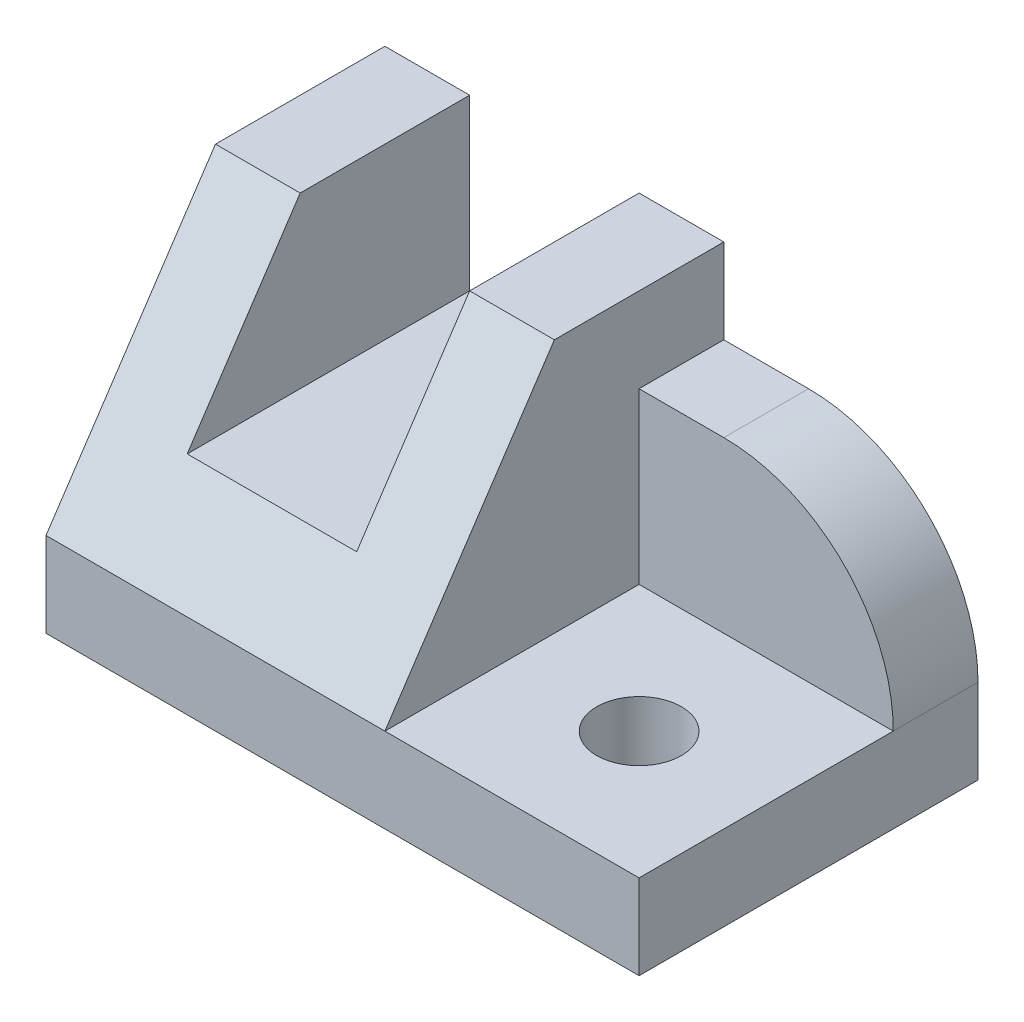
ISO-10303-21;
HEADER;
FILE_DESCRIPTION(('STEP AP214'),'2;1');
FILE_NAME('part.step','',(''),(''),'','','');
FILE_SCHEMA(('AUTOMOTIVE_DESIGN { 1 0 10303 214 1 1 1 1 }'));
ENDSEC;
DATA;
#1=APPLICATION_CONTEXT('core data for automotive mechanical design processes');
#2=APPLICATION_PROTOCOL_DEFINITION('international standard','automotive_design',2000,#1);
#3=PRODUCT_CONTEXT('',#1,'mechanical');
#4=PRODUCT('Part','Part','',(#3));
#5=PRODUCT_RELATED_PRODUCT_CATEGORY('part','',(#4));
#6=PRODUCT_DEFINITION_FORMATION('','',#4);
#7=PRODUCT_DEFINITION_CONTEXT('part definition',#1,'design');
#8=PRODUCT_DEFINITION('design','',#6,#7);
#9=PRODUCT_DEFINITION_SHAPE('','',#8);
#10=(LENGTH_UNIT() NAMED_UNIT(*) SI_UNIT(.MILLI.,.METRE.));
#11=(NAMED_UNIT(*) PLANE_ANGLE_UNIT() SI_UNIT($,.RADIAN.));
#12=(NAMED_UNIT(*) SI_UNIT($,.STERADIAN.) SOLID_ANGLE_UNIT());
#13=UNCERTAINTY_MEASURE_WITH_UNIT(LENGTH_MEASURE(1.E-05),#10,'distance_accuracy_value','');
#14=(GEOMETRIC_REPRESENTATION_CONTEXT(3) GLOBAL_UNCERTAINTY_ASSIGNED_CONTEXT((#13)) GLOBAL_UNIT_ASSIGNED_CONTEXT((#10,
#11,#12)) REPRESENTATION_CONTEXT('',''));
#15=CARTESIAN_POINT('',(0.,0.,0.));
#16=DIRECTION('',(0.,0.,1.));
#17=DIRECTION('',(1.,0.,0.));
#18=AXIS2_PLACEMENT_3D('',#15,#16,#17);
#19=CARTESIAN_POINT('',(5.,40.,0.));
#20=DIRECTION('',(0.,1.,0.));
#21=DIRECTION('',(0.,0.,1.));
#22=AXIS2_PLACEMENT_3D('',#19,#20,#21);
#23=PLANE('',#22);
#24=DIRECTION('',(0.,0.,-1.));
#25=VECTOR('',#24,1.);
#26=CARTESIAN_POINT('',(-25.,40.,20.001));
#27=LINE('',#26,#25);
#28=CARTESIAN_POINT('',(-25.,40.,0.));
#29=VERTEX_POINT('',#28);
#30=CARTESIAN_POINT('',(-25.,40.,-20.));
#31=VERTEX_POINT('',#30);
#32=EDGE_CURVE('E177',#29,#31,#27,.T.);
#33=ORIENTED_EDGE('',*,*,#32,.T.);
#34=DIRECTION('',(-1.,0.,0.));
#35=VECTOR('',#34,1.);
#36=CARTESIAN_POINT('',(5.,40.,-20.));
#37=LINE('',#36,#35);
#38=CARTESIAN_POINT('',(-35.,40.,-20.));
#39=VERTEX_POINT('',#38);
#40=EDGE_CURVE('E196',#31,#39,#37,.T.);
#41=ORIENTED_EDGE('',*,*,#40,.T.);
#42=DIRECTION('',(0.,0.,-1.));
#43=VECTOR('',#42,1.);
#44=CARTESIAN_POINT('',(-35.,40.,0.));
#45=LINE('',#44,#43);
#46=CARTESIAN_POINT('',(-35.,40.,0.));
#47=VERTEX_POINT('',#46);
#48=EDGE_CURVE('E180',#47,#39,#45,.T.);
#49=ORIENTED_EDGE('',*,*,#48,.F.);
#50=DIRECTION('',(-1.,0.,0.));
#51=VECTOR('',#50,1.);
#52=CARTESIAN_POINT('',(5.,40.,0.));
#53=LINE('',#52,#51);
#54=EDGE_CURVE('E205',#29,#47,#53,.T.);
#55=ORIENTED_EDGE('',*,*,#54,.F.);
#56=EDGE_LOOP('',(#33,#41,#49,#55));
#57=FACE_BOUND('',#56,.T.);
#58=ADVANCED_FACE('F33',(#57),#23,.T.);
#59=CARTESIAN_POINT('',(-35.,10.,-20.));
#60=DIRECTION('',(0.,0.,-1.));
#61=DIRECTION('',(-1.,0.,0.));
#62=AXIS2_PLACEMENT_3D('',#59,#60,#61);
#63=PLANE('',#62);
#64=CARTESIAN_POINT('',(15.,10.0000000000001,-20.));
#65=DIRECTION('',(0.,0.,-1.));
#66=DIRECTION('',(1.,0.,0.));
#67=AXIS2_PLACEMENT_3D('',#64,#65,#66);
#68=CIRCLE('',#67,20.);
#69=CARTESIAN_POINT('',(15.,30.0000000000001,-20.));
#70=VERTEX_POINT('',#69);
#71=CARTESIAN_POINT('',(35.,10.,-20.));
#72=VERTEX_POINT('',#71);
#73=EDGE_CURVE('E152',#70,#72,#68,.T.);
#74=ORIENTED_EDGE('',*,*,#73,.T.);
#75=DIRECTION('',(0.,-1.,0.));
#76=VECTOR('',#75,1.);
#77=CARTESIAN_POINT('',(35.,10.,-20.));
#78=LINE('',#77,#76);
#79=CARTESIAN_POINT('',(35.,0.,-20.));
#80=VERTEX_POINT('',#79);
#81=EDGE_CURVE('E37',#72,#80,#78,.T.);
#82=ORIENTED_EDGE('',*,*,#81,.T.);
#83=DIRECTION('',(1.,0.,0.));
#84=VECTOR('',#83,1.);
#85=CARTESIAN_POINT('',(-35.,0.,-20.));
#86=LINE('',#85,#84);
#87=CARTESIAN_POINT('',(-35.,0.,-20.));
#88=VERTEX_POINT('',#87);
#89=EDGE_CURVE('E212',#88,#80,#86,.T.);
#90=ORIENTED_EDGE('',*,*,#89,.F.);
#91=DIRECTION('',(0.,-1.,0.));
#92=VECTOR('',#91,1.);
#93=CARTESIAN_POINT('',(-35.,10.,-20.));
#94=LINE('',#93,#92);
#95=EDGE_CURVE('E11',#39,#88,#94,.T.);
#96=ORIENTED_EDGE('',*,*,#95,.F.);
#97=ORIENTED_EDGE('',*,*,#40,.F.);
#98=DIRECTION('',(0.,1.,0.));
#99=VECTOR('',#98,1.);
#100=CARTESIAN_POINT('',(-25.,40.,-20.));
#101=LINE('',#100,#99);
#102=CARTESIAN_POINT('',(-25.,20.,-20.));
#103=VERTEX_POINT('',#102);
#104=EDGE_CURVE('E170',#103,#31,#101,.T.);
#105=ORIENTED_EDGE('',*,*,#104,.F.);
#106=DIRECTION('',(-1.,0.,0.));
#107=VECTOR('',#106,1.);
#108=CARTESIAN_POINT('',(-5.00000000000001,20.,-20.));
#109=LINE('',#108,#107);
#110=CARTESIAN_POINT('',(-5.00000000000001,20.,-20.));
#111=VERTEX_POINT('',#110);
#112=EDGE_CURVE('E174',#111,#103,#109,.T.);
#113=ORIENTED_EDGE('',*,*,#112,.F.);
#114=DIRECTION('',(0.,-1.,0.));
#115=VECTOR('',#114,1.);
#116=CARTESIAN_POINT('',(-5.00000000000001,40.,-20.));
#117=LINE('',#116,#115);
#118=CARTESIAN_POINT('',(-5.00000000000001,40.,-20.));
#119=VERTEX_POINT('',#118);
#120=EDGE_CURVE('E172',#119,#111,#117,.T.);
#121=ORIENTED_EDGE('',*,*,#120,.F.);
#122=CARTESIAN_POINT('',(5.,40.,-20.));
#123=VERTEX_POINT('',#122);
#124=EDGE_CURVE('E206',#123,#119,#37,.T.);
#125=ORIENTED_EDGE('',*,*,#124,.F.);
#126=DIRECTION('',(0.,-1.,0.));
#127=VECTOR('',#126,1.);
#128=CARTESIAN_POINT('',(5.,40.,-20.));
#129=LINE('',#128,#127);
#130=CARTESIAN_POINT('',(5.,30.0000000000001,-20.));
#131=VERTEX_POINT('',#130);
#132=EDGE_CURVE('E189',#123,#131,#129,.T.);
#133=ORIENTED_EDGE('',*,*,#132,.T.);
#134=DIRECTION('',(1.,0.,0.));
#135=VECTOR('',#134,1.);
#136=CARTESIAN_POINT('',(5.,30.0000000000001,-20.));
#137=LINE('',#136,#135);
#138=EDGE_CURVE('E136',#131,#70,#137,.T.);
#139=ORIENTED_EDGE('',*,*,#138,.T.);
#140=EDGE_LOOP('',(#74,#82,#90,#96,#97,#105,#113,#121,#125,#133,#139));
#141=FACE_BOUND('',#140,.T.);
#142=ADVANCED_FACE('F35',(#141),#63,.T.);
#143=CARTESIAN_POINT('',(-35.,10.,-20.));
#144=DIRECTION('',(1.,0.,0.));
#145=DIRECTION('',(0.,0.,-1.));
#146=AXIS2_PLACEMENT_3D('',#143,#144,#145);
#147=PLANE('',#146);
#148=DIRECTION('',(0.,0.,1.));
#149=VECTOR('',#148,1.);
#150=CARTESIAN_POINT('',(-35.,0.,-20.));
#151=LINE('',#150,#149);
#152=CARTESIAN_POINT('',(-35.,0.,20.));
#153=VERTEX_POINT('',#152);
#154=EDGE_CURVE('E231',#88,#153,#151,.T.);
#155=ORIENTED_EDGE('',*,*,#154,.T.);
#156=DIRECTION('',(0.,-1.,0.));
#157=VECTOR('',#156,1.);
#158=CARTESIAN_POINT('',(-35.,10.,20.));
#159=LINE('',#158,#157);
#160=CARTESIAN_POINT('',(-35.,10.,20.));
#161=VERTEX_POINT('',#160);
#162=EDGE_CURVE('E42',#161,#153,#159,.T.);
#163=ORIENTED_EDGE('',*,*,#162,.F.);
#164=DIRECTION('',(0.,0.832050294337844,-0.554700196225229));
#165=VECTOR('',#164,1.);
#166=CARTESIAN_POINT('',(-35.,10.,20.));
#167=LINE('',#166,#165);
#168=EDGE_CURVE('E190',#161,#47,#167,.T.);
#169=ORIENTED_EDGE('',*,*,#168,.T.);
#170=ORIENTED_EDGE('',*,*,#48,.T.);
#171=ORIENTED_EDGE('',*,*,#95,.T.);
#172=EDGE_LOOP('',(#155,#163,#169,#170,#171));
#173=FACE_BOUND('',#172,.T.);
#174=ADVANCED_FACE('F250',(#173),#147,.F.);
#175=CARTESIAN_POINT('',(-35.,10.,20.));
#176=DIRECTION('',(0.,0.,-1.));
#177=DIRECTION('',(-1.,0.,0.));
#178=AXIS2_PLACEMENT_3D('',#175,#176,#177);
#179=PLANE('',#178);
#180=DIRECTION('',(1.,0.,0.));
#181=VECTOR('',#180,1.);
#182=CARTESIAN_POINT('',(-35.,0.,20.));
#183=LINE('',#182,#181);
#184=CARTESIAN_POINT('',(35.,0.,20.));
#185=VERTEX_POINT('',#184);
#186=EDGE_CURVE('E228',#153,#185,#183,.T.);
#187=ORIENTED_EDGE('',*,*,#186,.T.);
#188=DIRECTION('',(0.,-1.,0.));
#189=VECTOR('',#188,1.);
#190=CARTESIAN_POINT('',(35.,10.,20.));
#191=LINE('',#190,#189);
#192=CARTESIAN_POINT('',(35.,10.,20.));
#193=VERTEX_POINT('',#192);
#194=EDGE_CURVE('E234',#193,#185,#191,.T.);
#195=ORIENTED_EDGE('',*,*,#194,.F.);
#196=DIRECTION('',(1.,0.,0.));
#197=VECTOR('',#196,1.);
#198=CARTESIAN_POINT('',(-35.,10.,20.));
#199=LINE('',#198,#197);
#200=CARTESIAN_POINT('',(5.,10.,20.));
#201=VERTEX_POINT('',#200);
#202=EDGE_CURVE('E218',#201,#193,#199,.T.);
#203=ORIENTED_EDGE('',*,*,#202,.F.);
#204=EDGE_CURVE('E220',#161,#201,#199,.T.);
#205=ORIENTED_EDGE('',*,*,#204,.F.);
#206=ORIENTED_EDGE('',*,*,#162,.T.);
#207=EDGE_LOOP('',(#187,#195,#203,#205,#206));
#208=FACE_BOUND('',#207,.T.);
#209=ADVANCED_FACE('F253',(#208),#179,.F.);
#210=CARTESIAN_POINT('',(35.,10.,-20.));
#211=DIRECTION('',(1.,0.,0.));
#212=DIRECTION('',(0.,0.,-1.));
#213=AXIS2_PLACEMENT_3D('',#210,#211,#212);
#214=PLANE('',#213);
#215=DIRECTION('',(0.,0.,1.));
#216=VECTOR('',#215,1.);
#217=CARTESIAN_POINT('',(35.,0.,-20.));
#218=LINE('',#217,#216);
#219=EDGE_CURVE('E225',#80,#185,#218,.T.);
#220=ORIENTED_EDGE('',*,*,#219,.F.);
#221=ORIENTED_EDGE('',*,*,#81,.F.);
#222=DIRECTION('',(0.,0.,1.));
#223=VECTOR('',#222,1.);
#224=CARTESIAN_POINT('',(35.,10.,-20.));
#225=LINE('',#224,#223);
#226=CARTESIAN_POINT('',(35.,10.,-10.));
#227=VERTEX_POINT('',#226);
#228=EDGE_CURVE('E215',#72,#227,#225,.T.);
#229=ORIENTED_EDGE('',*,*,#228,.T.);
#230=EDGE_CURVE('E219',#227,#193,#225,.T.);
#231=ORIENTED_EDGE('',*,*,#230,.T.);
#232=ORIENTED_EDGE('',*,*,#194,.T.);
#233=EDGE_LOOP('',(#220,#221,#229,#231,#232));
#234=FACE_BOUND('',#233,.T.);
#235=ADVANCED_FACE('F243',(#234),#214,.T.);
#236=CARTESIAN_POINT('',(0.,10.,0.));
#237=DIRECTION('',(0.,-1.,0.));
#238=DIRECTION('',(0.,0.,-1.));
#239=AXIS2_PLACEMENT_3D('',#236,#237,#238);
#240=PLANE('',#239);
#241=CARTESIAN_POINT('',(20.,10.,5.));
#242=DIRECTION('',(0.,1.,0.));
#243=DIRECTION('',(0.,0.,1.));
#244=AXIS2_PLACEMENT_3D('',#241,#242,#243);
#245=CIRCLE('',#244,5.);
#246=CARTESIAN_POINT('',(20.,10.,10.));
#247=VERTEX_POINT('',#246);
#248=EDGE_CURVE('E209',#247,#247,#245,.T.);
#249=ORIENTED_EDGE('',*,*,#248,.F.);
#250=EDGE_LOOP('',(#249));
#251=FACE_BOUND('',#250,.T.);
#252=ORIENTED_EDGE('',*,*,#230,.F.);
#253=DIRECTION('',(-1.,0.,0.));
#254=VECTOR('',#253,1.);
#255=CARTESIAN_POINT('',(5.,10.,-10.));
#256=LINE('',#255,#254);
#257=CARTESIAN_POINT('',(5.,10.,-10.));
#258=VERTEX_POINT('',#257);
#259=EDGE_CURVE('E142',#227,#258,#256,.T.);
#260=ORIENTED_EDGE('',*,*,#259,.T.);
#261=DIRECTION('',(0.,0.,1.));
#262=VECTOR('',#261,1.);
#263=CARTESIAN_POINT('',(5.,10.,-20.));
#264=LINE('',#263,#262);
#265=EDGE_CURVE('E58',#258,#201,#264,.T.);
#266=ORIENTED_EDGE('',*,*,#265,.T.);
#267=ORIENTED_EDGE('',*,*,#202,.T.);
#268=EDGE_LOOP('',(#252,#260,#266,#267));
#269=FACE_BOUND('',#268,.T.);
#270=ADVANCED_FACE('F299',(#251,#269),#240,.F.);
#271=CARTESIAN_POINT('',(0.,0.,0.));
#272=DIRECTION('',(0.,-1.,0.));
#273=DIRECTION('',(0.,0.,-1.));
#274=AXIS2_PLACEMENT_3D('',#271,#272,#273);
#275=PLANE('',#274);
#276=CARTESIAN_POINT('',(20.,0.,5.));
#277=DIRECTION('',(0.,-1.,0.));
#278=DIRECTION('',(0.,0.,-1.));
#279=AXIS2_PLACEMENT_3D('',#276,#277,#278);
#280=CIRCLE('',#279,5.);
#281=CARTESIAN_POINT('',(20.,0.,0.));
#282=VERTEX_POINT('',#281);
#283=EDGE_CURVE('E204',#282,#282,#280,.F.);
#284=ORIENTED_EDGE('',*,*,#283,.T.);
#285=EDGE_LOOP('',(#284));
#286=FACE_BOUND('',#285,.T.);
#287=ORIENTED_EDGE('',*,*,#89,.T.);
#288=ORIENTED_EDGE('',*,*,#219,.T.);
#289=ORIENTED_EDGE('',*,*,#186,.F.);
#290=ORIENTED_EDGE('',*,*,#154,.F.);
#291=EDGE_LOOP('',(#287,#288,#289,#290));
#292=FACE_BOUND('',#291,.T.);
#293=ADVANCED_FACE('F247',(#286,#292),#275,.T.);
#294=CARTESIAN_POINT('',(20.,-0.000999999999999265,5.));
#295=DIRECTION('',(0.,1.,0.));
#296=DIRECTION('',(0.,0.,1.));
#297=AXIS2_PLACEMENT_3D('',#294,#295,#296);
#298=CYLINDRICAL_SURFACE('',#297,5.);
#299=ORIENTED_EDGE('',*,*,#283,.F.);
#300=EDGE_LOOP('',(#299));
#301=FACE_BOUND('',#300,.T.);
#302=ORIENTED_EDGE('',*,*,#248,.T.);
#303=EDGE_LOOP('',(#302));
#304=FACE_BOUND('',#303,.T.);
#305=ADVANCED_FACE('F275',(#301,#304),#298,.F.);
#306=DIRECTION('',(0.,0.,-1.));
#307=VECTOR('',#306,1.);
#308=CARTESIAN_POINT('',(-5.00000000000001,40.,20.001));
#309=LINE('',#308,#307);
#310=CARTESIAN_POINT('',(-5.00000000000001,40.,0.));
#311=VERTEX_POINT('',#310);
#312=EDGE_CURVE('E182',#311,#119,#309,.T.);
#313=ORIENTED_EDGE('',*,*,#312,.F.);
#314=CARTESIAN_POINT('',(5.,40.,0.));
#315=VERTEX_POINT('',#314);
#316=EDGE_CURVE('E201',#315,#311,#53,.T.);
#317=ORIENTED_EDGE('',*,*,#316,.F.);
#318=DIRECTION('',(0.,0.,-1.));
#319=VECTOR('',#318,1.);
#320=CARTESIAN_POINT('',(5.,40.,0.));
#321=LINE('',#320,#319);
#322=EDGE_CURVE('E186',#315,#123,#321,.T.);
#323=ORIENTED_EDGE('',*,*,#322,.T.);
#324=ORIENTED_EDGE('',*,*,#124,.T.);
#325=EDGE_LOOP('',(#313,#317,#323,#324));
#326=FACE_BOUND('',#325,.T.);
#327=ADVANCED_FACE('F272',(#326),#23,.T.);
#328=CARTESIAN_POINT('',(5.,10.,20.));
#329=DIRECTION('',(0.,0.554700196225229,0.832050294337844));
#330=DIRECTION('',(0.,-0.832050294337844,0.554700196225229));
#331=AXIS2_PLACEMENT_3D('',#328,#329,#330);
#332=PLANE('',#331);
#333=DIRECTION('',(0.,0.832050294337844,-0.554700196225229));
#334=VECTOR('',#333,1.);
#335=CARTESIAN_POINT('',(-25.,30.7687692307692,6.15415384615385));
#336=LINE('',#335,#334);
#337=CARTESIAN_POINT('',(-25.,20.,13.3333333333333));
#338=VERTEX_POINT('',#337);
#339=EDGE_CURVE('E167',#338,#29,#336,.T.);
#340=ORIENTED_EDGE('',*,*,#339,.T.);
#341=ORIENTED_EDGE('',*,*,#54,.T.);
#342=ORIENTED_EDGE('',*,*,#168,.F.);
#343=ORIENTED_EDGE('',*,*,#204,.T.);
#344=DIRECTION('',(0.,0.832050294337844,-0.554700196225229));
#345=VECTOR('',#344,1.);
#346=CARTESIAN_POINT('',(5.,10.,20.));
#347=LINE('',#346,#345);
#348=EDGE_CURVE('E193',#201,#315,#347,.T.);
#349=ORIENTED_EDGE('',*,*,#348,.T.);
#350=ORIENTED_EDGE('',*,*,#316,.T.);
#351=DIRECTION('',(0.,-0.832050294337844,0.554700196225229));
#352=VECTOR('',#351,1.);
#353=CARTESIAN_POINT('',(-5.00000000000001,30.7687692307692,6.15415384615385));
#354=LINE('',#353,#352);
#355=CARTESIAN_POINT('',(-5.00000000000001,20.,13.3333333333333));
#356=VERTEX_POINT('',#355);
#357=EDGE_CURVE('E160',#311,#356,#354,.T.);
#358=ORIENTED_EDGE('',*,*,#357,.T.);
#359=DIRECTION('',(-1.,0.,0.));
#360=VECTOR('',#359,1.);
#361=CARTESIAN_POINT('',(-5.00000000000001,20.,13.3333333333333));
#362=LINE('',#361,#360);
#363=EDGE_CURVE('E164',#356,#338,#362,.T.);
#364=ORIENTED_EDGE('',*,*,#363,.T.);
#365=EDGE_LOOP('',(#340,#341,#342,#343,#349,#350,#358,#364));
#366=FACE_BOUND('',#365,.T.);
#367=ADVANCED_FACE('F256',(#366),#332,.T.);
#368=CARTESIAN_POINT('',(5.,0.,0.));
#369=DIRECTION('',(-1.,0.,0.));
#370=DIRECTION('',(0.,0.,1.));
#371=AXIS2_PLACEMENT_3D('',#368,#369,#370);
#372=PLANE('',#371);
#373=DIRECTION('',(0.,1.,0.));
#374=VECTOR('',#373,1.);
#375=CARTESIAN_POINT('',(5.,10.,-10.));
#376=LINE('',#375,#374);
#377=CARTESIAN_POINT('',(5.,30.0000000000001,-10.));
#378=VERTEX_POINT('',#377);
#379=EDGE_CURVE('E148',#258,#378,#376,.T.);
#380=ORIENTED_EDGE('',*,*,#379,.T.);
#381=DIRECTION('',(0.,0.,-1.));
#382=VECTOR('',#381,1.);
#383=CARTESIAN_POINT('',(5.,30.0000000000001,-10.));
#384=LINE('',#383,#382);
#385=EDGE_CURVE('E131',#378,#131,#384,.T.);
#386=ORIENTED_EDGE('',*,*,#385,.T.);
#387=ORIENTED_EDGE('',*,*,#132,.F.);
#388=ORIENTED_EDGE('',*,*,#322,.F.);
#389=ORIENTED_EDGE('',*,*,#348,.F.);
#390=ORIENTED_EDGE('',*,*,#265,.F.);
#391=EDGE_LOOP('',(#380,#386,#387,#388,#389,#390));
#392=FACE_BOUND('',#391,.T.);
#393=ADVANCED_FACE('F151',(#392),#372,.F.);
#394=CARTESIAN_POINT('',(-25.,40.,20.001));
#395=DIRECTION('',(-1.,0.,0.));
#396=DIRECTION('',(0.,-1.,0.));
#397=AXIS2_PLACEMENT_3D('',#394,#395,#396);
#398=PLANE('',#397);
#399=DIRECTION('',(0.,0.,-1.));
#400=VECTOR('',#399,1.);
#401=CARTESIAN_POINT('',(-25.,20.,20.001));
#402=LINE('',#401,#400);
#403=EDGE_CURVE('E178',#338,#103,#402,.T.);
#404=ORIENTED_EDGE('',*,*,#403,.T.);
#405=ORIENTED_EDGE('',*,*,#104,.T.);
#406=ORIENTED_EDGE('',*,*,#32,.F.);
#407=ORIENTED_EDGE('',*,*,#339,.F.);
#408=EDGE_LOOP('',(#404,#405,#406,#407));
#409=FACE_BOUND('',#408,.T.);
#410=ADVANCED_FACE('F265',(#409),#398,.F.);
#411=CARTESIAN_POINT('',(-5.00000000000001,20.,20.001));
#412=DIRECTION('',(0.,-1.,0.));
#413=DIRECTION('',(0.,0.,-1.));
#414=AXIS2_PLACEMENT_3D('',#411,#412,#413);
#415=PLANE('',#414);
#416=DIRECTION('',(0.,0.,-1.));
#417=VECTOR('',#416,1.);
#418=CARTESIAN_POINT('',(-5.00000000000001,20.,20.001));
#419=LINE('',#418,#417);
#420=EDGE_CURVE('E50',#356,#111,#419,.T.);
#421=ORIENTED_EDGE('',*,*,#420,.T.);
#422=ORIENTED_EDGE('',*,*,#112,.T.);
#423=ORIENTED_EDGE('',*,*,#403,.F.);
#424=ORIENTED_EDGE('',*,*,#363,.F.);
#425=EDGE_LOOP('',(#421,#422,#423,#424));
#426=FACE_BOUND('',#425,.T.);
#427=ADVANCED_FACE('F268',(#426),#415,.F.);
#428=CARTESIAN_POINT('',(-5.00000000000001,40.,20.001));
#429=DIRECTION('',(1.,0.,0.));
#430=DIRECTION('',(0.,1.,0.));
#431=AXIS2_PLACEMENT_3D('',#428,#429,#430);
#432=PLANE('',#431);
#433=ORIENTED_EDGE('',*,*,#312,.T.);
#434=ORIENTED_EDGE('',*,*,#120,.T.);
#435=ORIENTED_EDGE('',*,*,#420,.F.);
#436=ORIENTED_EDGE('',*,*,#357,.F.);
#437=EDGE_LOOP('',(#433,#434,#435,#436));
#438=FACE_BOUND('',#437,.T.);
#439=ADVANCED_FACE('F269',(#438),#432,.F.);
#440=CARTESIAN_POINT('',(15.,10.0000000000001,-10.));
#441=DIRECTION('',(0.,0.,-1.));
#442=DIRECTION('',(-1.,0.,0.));
#443=AXIS2_PLACEMENT_3D('',#440,#441,#442);
#444=CYLINDRICAL_SURFACE('',#443,20.);
#445=ORIENTED_EDGE('',*,*,#73,.F.);
#446=DIRECTION('',(0.,0.,-1.));
#447=VECTOR('',#446,1.);
#448=CARTESIAN_POINT('',(15.,30.0000000000001,-10.));
#449=LINE('',#448,#447);
#450=CARTESIAN_POINT('',(15.,30.0000000000001,-10.));
#451=VERTEX_POINT('',#450);
#452=EDGE_CURVE('E141',#451,#70,#449,.T.);
#453=ORIENTED_EDGE('',*,*,#452,.F.);
#454=CARTESIAN_POINT('',(15.,10.0000000000001,-10.));
#455=DIRECTION('',(0.,0.,-1.));
#456=DIRECTION('',(1.,0.,0.));
#457=AXIS2_PLACEMENT_3D('',#454,#455,#456);
#458=CIRCLE('',#457,20.);
#459=EDGE_CURVE('E149',#451,#227,#458,.T.);
#460=ORIENTED_EDGE('',*,*,#459,.T.);
#461=ORIENTED_EDGE('',*,*,#228,.F.);
#462=EDGE_LOOP('',(#445,#453,#460,#461));
#463=FACE_BOUND('',#462,.T.);
#464=ADVANCED_FACE('F311',(#463),#444,.T.);
#465=CARTESIAN_POINT('',(5.,30.0000000000001,-10.));
#466=DIRECTION('',(0.,1.,0.));
#467=DIRECTION('',(0.,0.,1.));
#468=AXIS2_PLACEMENT_3D('',#465,#466,#467);
#469=PLANE('',#468);
#470=ORIENTED_EDGE('',*,*,#138,.F.);
#471=ORIENTED_EDGE('',*,*,#385,.F.);
#472=DIRECTION('',(1.,0.,0.));
#473=VECTOR('',#472,1.);
#474=CARTESIAN_POINT('',(5.,30.0000000000001,-10.));
#475=LINE('',#474,#473);
#476=EDGE_CURVE('E134',#378,#451,#475,.T.);
#477=ORIENTED_EDGE('',*,*,#476,.T.);
#478=ORIENTED_EDGE('',*,*,#452,.T.);
#479=EDGE_LOOP('',(#470,#471,#477,#478));
#480=FACE_BOUND('',#479,.T.);
#481=ADVANCED_FACE('F133',(#480),#469,.T.);
#482=CARTESIAN_POINT('',(15.,10.0000000000001,-10.));
#483=DIRECTION('',(0.,0.,1.));
#484=DIRECTION('',(1.,0.,0.));
#485=AXIS2_PLACEMENT_3D('',#482,#483,#484);
#486=PLANE('',#485);
#487=ORIENTED_EDGE('',*,*,#379,.F.);
#488=ORIENTED_EDGE('',*,*,#259,.F.);
#489=ORIENTED_EDGE('',*,*,#459,.F.);
#490=ORIENTED_EDGE('',*,*,#476,.F.);
#491=EDGE_LOOP('',(#487,#488,#489,#490));
#492=FACE_BOUND('',#491,.T.);
#493=ADVANCED_FACE('F146',(#492),#486,.T.);
#494=CLOSED_SHELL('',(#58,#142,#174,#209,#235,#270,#293,#305,#327,#367,#393,#410,#427,#439,#464,
#481,#493));
#495=MANIFOLD_SOLID_BREP('B2',#494);
#496=ADVANCED_BREP_SHAPE_REPRESENTATION('',(#18,#495),#14);
#497=SHAPE_DEFINITION_REPRESENTATION(#9,#496);
ENDSEC;
END-ISO-10303-21;
